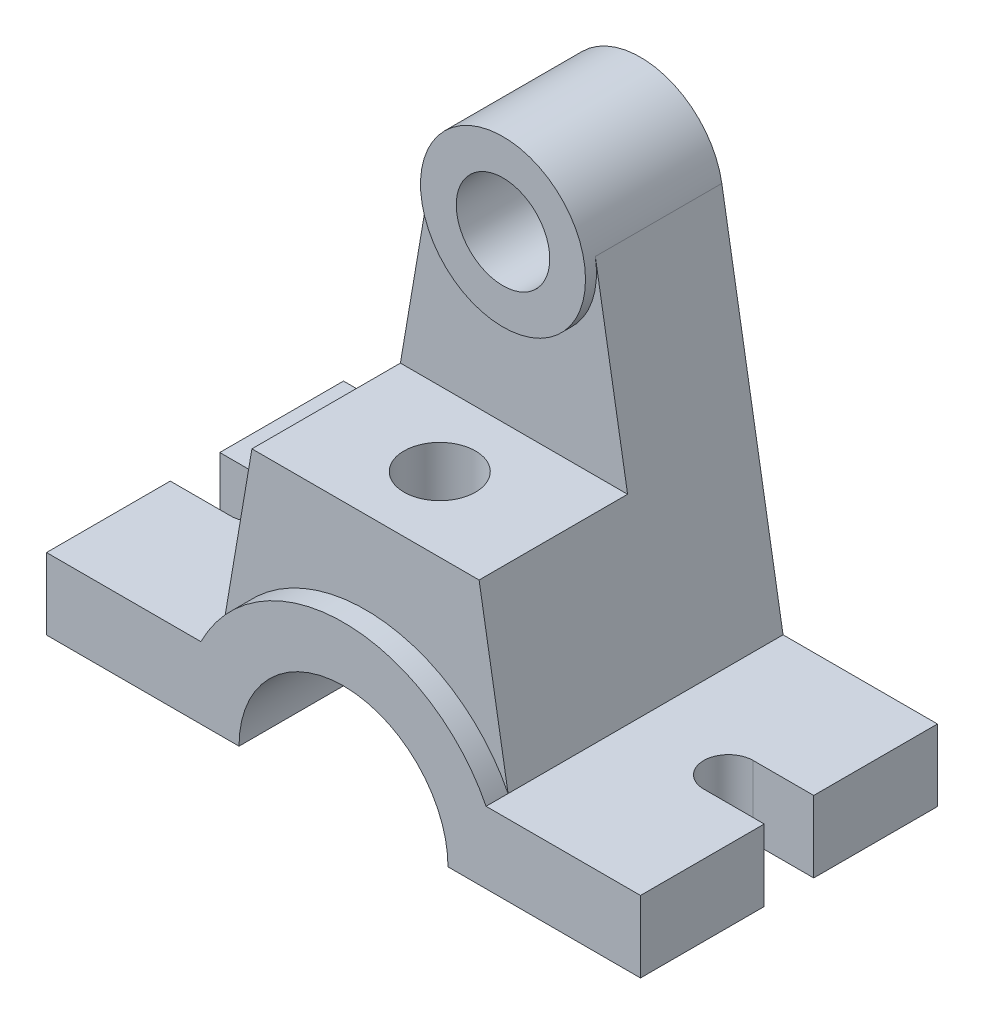
ISO-10303-21;
HEADER;
FILE_DESCRIPTION(('STEP AP214'),'2;1');
FILE_NAME('part.step','',(''),(''),'','','');
FILE_SCHEMA(('AUTOMOTIVE_DESIGN { 1 0 10303 214 1 1 1 1 }'));
ENDSEC;
DATA;
#1=APPLICATION_CONTEXT('core data for automotive mechanical design processes');
#2=APPLICATION_PROTOCOL_DEFINITION('international standard','automotive_design',2000,#1);
#3=PRODUCT_CONTEXT('',#1,'mechanical');
#4=PRODUCT('Part','Part','',(#3));
#5=PRODUCT_RELATED_PRODUCT_CATEGORY('part','',(#4));
#6=PRODUCT_DEFINITION_FORMATION('','',#4);
#7=PRODUCT_DEFINITION_CONTEXT('part definition',#1,'design');
#8=PRODUCT_DEFINITION('design','',#6,#7);
#9=PRODUCT_DEFINITION_SHAPE('','',#8);
#10=(LENGTH_UNIT() NAMED_UNIT(*) SI_UNIT(.MILLI.,.METRE.));
#11=(NAMED_UNIT(*) PLANE_ANGLE_UNIT() SI_UNIT($,.RADIAN.));
#12=(NAMED_UNIT(*) SI_UNIT($,.STERADIAN.) SOLID_ANGLE_UNIT());
#13=UNCERTAINTY_MEASURE_WITH_UNIT(LENGTH_MEASURE(1.E-05),#10,'distance_accuracy_value','');
#14=(GEOMETRIC_REPRESENTATION_CONTEXT(3) GLOBAL_UNCERTAINTY_ASSIGNED_CONTEXT((#13)) GLOBAL_UNIT_ASSIGNED_CONTEXT((#10,
#11,#12)) REPRESENTATION_CONTEXT('',''));
#15=CARTESIAN_POINT('',(0.,0.,0.));
#16=DIRECTION('',(0.,0.,1.));
#17=DIRECTION('',(1.,0.,0.));
#18=AXIS2_PLACEMENT_3D('',#15,#16,#17);
#19=CARTESIAN_POINT('',(-54.,0.,54.));
#20=DIRECTION('',(-1.,0.,0.));
#21=DIRECTION('',(0.,0.,1.));
#22=AXIS2_PLACEMENT_3D('',#19,#20,#21);
#23=PLANE('',#22);
#24=DIRECTION('',(0.,1.,0.));
#25=VECTOR('',#24,1.);
#26=CARTESIAN_POINT('',(-54.,-0.000999999999999265,31.5));
#27=LINE('',#26,#25);
#28=CARTESIAN_POINT('',(-54.,0.,31.5));
#29=VERTEX_POINT('',#28);
#30=CARTESIAN_POINT('',(-54.,13.,31.5));
#31=VERTEX_POINT('',#30);
#32=EDGE_CURVE('E216',#29,#31,#27,.T.);
#33=ORIENTED_EDGE('',*,*,#32,.F.);
#34=DIRECTION('',(0.,0.,-1.));
#35=VECTOR('',#34,1.);
#36=CARTESIAN_POINT('',(-54.,0.,54.));
#37=LINE('',#36,#35);
#38=CARTESIAN_POINT('',(-54.,0.,54.));
#39=VERTEX_POINT('',#38);
#40=EDGE_CURVE('E307',#39,#29,#37,.T.);
#41=ORIENTED_EDGE('',*,*,#40,.F.);
#42=DIRECTION('',(0.,1.,0.));
#43=VECTOR('',#42,1.);
#44=CARTESIAN_POINT('',(-54.,0.,54.));
#45=LINE('',#44,#43);
#46=CARTESIAN_POINT('',(-54.,13.,54.));
#47=VERTEX_POINT('',#46);
#48=EDGE_CURVE('E356',#39,#47,#45,.T.);
#49=ORIENTED_EDGE('',*,*,#48,.T.);
#50=DIRECTION('',(0.,0.,-1.));
#51=VECTOR('',#50,1.);
#52=CARTESIAN_POINT('',(-54.,13.,54.));
#53=LINE('',#52,#51);
#54=EDGE_CURVE('E47',#47,#31,#53,.T.);
#55=ORIENTED_EDGE('',*,*,#54,.T.);
#56=EDGE_LOOP('',(#33,#41,#49,#55));
#57=FACE_BOUND('',#56,.T.);
#58=ADVANCED_FACE('F39',(#57),#23,.T.);
#59=CARTESIAN_POINT('',(54.,0.,54.));
#60=DIRECTION('',(-1.,0.,0.));
#61=DIRECTION('',(0.,0.,1.));
#62=AXIS2_PLACEMENT_3D('',#59,#60,#61);
#63=PLANE('',#62);
#64=DIRECTION('',(0.,0.,-1.));
#65=VECTOR('',#64,1.);
#66=CARTESIAN_POINT('',(54.,13.,54.));
#67=LINE('',#66,#65);
#68=CARTESIAN_POINT('',(54.,13.,22.5));
#69=VERTEX_POINT('',#68);
#70=CARTESIAN_POINT('',(54.,13.,0.));
#71=VERTEX_POINT('',#70);
#72=EDGE_CURVE('E322',#69,#71,#67,.T.);
#73=ORIENTED_EDGE('',*,*,#72,.F.);
#74=DIRECTION('',(0.,1.,0.));
#75=VECTOR('',#74,1.);
#76=CARTESIAN_POINT('',(54.,-0.0010000000000062,22.5));
#77=LINE('',#76,#75);
#78=CARTESIAN_POINT('',(54.,0.,22.5));
#79=VERTEX_POINT('',#78);
#80=EDGE_CURVE('E232',#79,#69,#77,.T.);
#81=ORIENTED_EDGE('',*,*,#80,.F.);
#82=DIRECTION('',(0.,0.,-1.));
#83=VECTOR('',#82,1.);
#84=CARTESIAN_POINT('',(54.,0.,54.));
#85=LINE('',#84,#83);
#86=CARTESIAN_POINT('',(54.,0.,0.));
#87=VERTEX_POINT('',#86);
#88=EDGE_CURVE('E318',#79,#87,#85,.T.);
#89=ORIENTED_EDGE('',*,*,#88,.T.);
#90=DIRECTION('',(0.,1.,0.));
#91=VECTOR('',#90,1.);
#92=CARTESIAN_POINT('',(54.,0.,0.));
#93=LINE('',#92,#91);
#94=EDGE_CURVE('E330',#87,#71,#93,.T.);
#95=ORIENTED_EDGE('',*,*,#94,.T.);
#96=EDGE_LOOP('',(#73,#81,#89,#95));
#97=FACE_BOUND('',#96,.T.);
#98=ADVANCED_FACE('F277',(#97),#63,.F.);
#99=CARTESIAN_POINT('',(0.,0.,54.));
#100=DIRECTION('',(0.,0.,-1.));
#101=DIRECTION('',(-1.,0.,0.));
#102=AXIS2_PLACEMENT_3D('',#99,#100,#101);
#103=CYLINDRICAL_SURFACE('',#102,29.);
#104=DIRECTION('',(0.,0.,-1.));
#105=VECTOR('',#104,1.);
#106=CARTESIAN_POINT('',(25.9229627936314,13.,54.));
#107=LINE('',#106,#105);
#108=CARTESIAN_POINT('',(25.9229627936314,13.,54.));
#109=VERTEX_POINT('',#108);
#110=CARTESIAN_POINT('',(25.9229627936314,13.,50.));
#111=VERTEX_POINT('',#110);
#112=EDGE_CURVE('E323',#109,#111,#107,.T.);
#113=ORIENTED_EDGE('',*,*,#112,.T.);
#114=CARTESIAN_POINT('',(0.,0.,50.));
#115=DIRECTION('',(0.,0.,1.));
#116=DIRECTION('',(1.,0.,0.));
#117=AXIS2_PLACEMENT_3D('',#114,#115,#116);
#118=CIRCLE('',#117,29.);
#119=CARTESIAN_POINT('',(-25.9229627936314,13.,50.));
#120=VERTEX_POINT('',#119);
#121=EDGE_CURVE('E373',#111,#120,#118,.T.);
#122=ORIENTED_EDGE('',*,*,#121,.T.);
#123=DIRECTION('',(0.,0.,-1.));
#124=VECTOR('',#123,1.);
#125=CARTESIAN_POINT('',(-25.9229627936314,13.,54.));
#126=LINE('',#125,#124);
#127=CARTESIAN_POINT('',(-25.9229627936314,13.,54.));
#128=VERTEX_POINT('',#127);
#129=EDGE_CURVE('E12',#128,#120,#126,.T.);
#130=ORIENTED_EDGE('',*,*,#129,.F.);
#131=CARTESIAN_POINT('',(0.,0.,54.));
#132=DIRECTION('',(0.,0.,1.));
#133=DIRECTION('',(1.,0.,0.));
#134=AXIS2_PLACEMENT_3D('',#131,#132,#133);
#135=CIRCLE('',#134,29.);
#136=EDGE_CURVE('E329',#109,#128,#135,.T.);
#137=ORIENTED_EDGE('',*,*,#136,.F.);
#138=EDGE_LOOP('',(#113,#122,#130,#137));
#139=FACE_BOUND('',#138,.T.);
#140=ADVANCED_FACE('F41',(#139),#103,.T.);
#141=CARTESIAN_POINT('',(0.,13.,54.));
#142=DIRECTION('',(0.,1.,0.));
#143=DIRECTION('',(-1.,0.,0.));
#144=AXIS2_PLACEMENT_3D('',#141,#142,#143);
#145=PLANE('',#144);
#146=DIRECTION('',(1.,0.,0.));
#147=VECTOR('',#146,1.);
#148=CARTESIAN_POINT('',(-43.,13.,31.5));
#149=LINE('',#148,#147);
#150=CARTESIAN_POINT('',(-43.,13.,31.5));
#151=VERTEX_POINT('',#150);
#152=EDGE_CURVE('E191',#31,#151,#149,.T.);
#153=ORIENTED_EDGE('',*,*,#152,.F.);
#154=ORIENTED_EDGE('',*,*,#54,.F.);
#155=DIRECTION('',(1.,0.,0.));
#156=VECTOR('',#155,1.);
#157=CARTESIAN_POINT('',(0.,13.,54.));
#158=LINE('',#157,#156);
#159=EDGE_CURVE('E359',#47,#128,#158,.T.);
#160=ORIENTED_EDGE('',*,*,#159,.T.);
#161=ORIENTED_EDGE('',*,*,#129,.T.);
#162=DIRECTION('',(0.,0.,-1.));
#163=VECTOR('',#162,1.);
#164=CARTESIAN_POINT('',(-25.9229627936314,13.,114.406953242156));
#165=LINE('',#164,#163);
#166=CARTESIAN_POINT('',(-25.9229627936314,13.,0.));
#167=VERTEX_POINT('',#166);
#168=EDGE_CURVE('E371',#120,#167,#165,.T.);
#169=ORIENTED_EDGE('',*,*,#168,.T.);
#170=DIRECTION('',(1.,0.,0.));
#171=VECTOR('',#170,1.);
#172=CARTESIAN_POINT('',(0.,13.,0.));
#173=LINE('',#172,#171);
#174=CARTESIAN_POINT('',(-54.,13.,0.));
#175=VERTEX_POINT('',#174);
#176=EDGE_CURVE('E305',#175,#167,#173,.T.);
#177=ORIENTED_EDGE('',*,*,#176,.F.);
#178=CARTESIAN_POINT('',(-54.,13.,22.5));
#179=VERTEX_POINT('',#178);
#180=EDGE_CURVE('E300',#179,#175,#53,.T.);
#181=ORIENTED_EDGE('',*,*,#180,.F.);
#182=DIRECTION('',(-1.,0.,0.));
#183=VECTOR('',#182,1.);
#184=CARTESIAN_POINT('',(-43.,13.,22.5));
#185=LINE('',#184,#183);
#186=CARTESIAN_POINT('',(-43.,13.,22.5));
#187=VERTEX_POINT('',#186);
#188=EDGE_CURVE('E211',#187,#179,#185,.T.);
#189=ORIENTED_EDGE('',*,*,#188,.F.);
#190=CARTESIAN_POINT('',(-43.,13.,27.));
#191=DIRECTION('',(0.,1.,0.));
#192=DIRECTION('',(-1.,0.,0.));
#193=AXIS2_PLACEMENT_3D('',#190,#191,#192);
#194=CIRCLE('',#193,4.5);
#195=EDGE_CURVE('E189',#151,#187,#194,.T.);
#196=ORIENTED_EDGE('',*,*,#195,.F.);
#197=EDGE_LOOP('',(#153,#154,#160,#161,#169,#177,#181,#189,#196));
#198=FACE_BOUND('',#197,.T.);
#199=ADVANCED_FACE('F290',(#198),#145,.T.);
#200=DIRECTION('',(0.,1.,0.));
#201=VECTOR('',#200,1.);
#202=CARTESIAN_POINT('',(-54.,-0.000999999999999265,22.5));
#203=LINE('',#202,#201);
#204=CARTESIAN_POINT('',(-54.,0.,22.5));
#205=VERTEX_POINT('',#204);
#206=EDGE_CURVE('E54',#205,#179,#203,.T.);
#207=ORIENTED_EDGE('',*,*,#206,.T.);
#208=ORIENTED_EDGE('',*,*,#180,.T.);
#209=DIRECTION('',(0.,1.,0.));
#210=VECTOR('',#209,1.);
#211=CARTESIAN_POINT('',(-54.,0.,0.));
#212=LINE('',#211,#210);
#213=CARTESIAN_POINT('',(-54.,0.,0.));
#214=VERTEX_POINT('',#213);
#215=EDGE_CURVE('E342',#214,#175,#212,.T.);
#216=ORIENTED_EDGE('',*,*,#215,.F.);
#217=EDGE_CURVE('E302',#205,#214,#37,.T.);
#218=ORIENTED_EDGE('',*,*,#217,.F.);
#219=EDGE_LOOP('',(#207,#208,#216,#218));
#220=FACE_BOUND('',#219,.T.);
#221=ADVANCED_FACE('F280',(#220),#23,.T.);
#222=CARTESIAN_POINT('',(0.,0.,54.));
#223=DIRECTION('',(0.,1.,0.));
#224=DIRECTION('',(0.,0.,1.));
#225=AXIS2_PLACEMENT_3D('',#222,#223,#224);
#226=PLANE('',#225);
#227=ORIENTED_EDGE('',*,*,#40,.T.);
#228=DIRECTION('',(-1.,0.,0.));
#229=VECTOR('',#228,1.);
#230=CARTESIAN_POINT('',(-43.,0.,31.5));
#231=LINE('',#230,#229);
#232=CARTESIAN_POINT('',(-43.,0.,31.5));
#233=VERTEX_POINT('',#232);
#234=EDGE_CURVE('E202',#233,#29,#231,.T.);
#235=ORIENTED_EDGE('',*,*,#234,.F.);
#236=CARTESIAN_POINT('',(-43.,0.,27.));
#237=DIRECTION('',(0.,1.,0.));
#238=DIRECTION('',(0.,0.,1.));
#239=AXIS2_PLACEMENT_3D('',#236,#237,#238);
#240=CIRCLE('',#239,4.5);
#241=CARTESIAN_POINT('',(-43.,0.,22.5));
#242=VERTEX_POINT('',#241);
#243=EDGE_CURVE('E186',#242,#233,#240,.F.);
#244=ORIENTED_EDGE('',*,*,#243,.F.);
#245=DIRECTION('',(1.,0.,0.));
#246=VECTOR('',#245,1.);
#247=CARTESIAN_POINT('',(-43.,0.,22.5));
#248=LINE('',#247,#246);
#249=EDGE_CURVE('E193',#205,#242,#248,.T.);
#250=ORIENTED_EDGE('',*,*,#249,.F.);
#251=ORIENTED_EDGE('',*,*,#217,.T.);
#252=DIRECTION('',(1.,0.,0.));
#253=VECTOR('',#252,1.);
#254=CARTESIAN_POINT('',(0.,0.,0.));
#255=LINE('',#254,#253);
#256=CARTESIAN_POINT('',(-19.,0.,0.));
#257=VERTEX_POINT('',#256);
#258=EDGE_CURVE('E339',#214,#257,#255,.T.);
#259=ORIENTED_EDGE('',*,*,#258,.T.);
#260=DIRECTION('',(0.,0.,-1.));
#261=VECTOR('',#260,1.);
#262=CARTESIAN_POINT('',(-19.,0.,54.));
#263=LINE('',#262,#261);
#264=CARTESIAN_POINT('',(-19.,0.,54.));
#265=VERTEX_POINT('',#264);
#266=EDGE_CURVE('E311',#265,#257,#263,.T.);
#267=ORIENTED_EDGE('',*,*,#266,.F.);
#268=DIRECTION('',(1.,0.,0.));
#269=VECTOR('',#268,1.);
#270=CARTESIAN_POINT('',(0.,0.,54.));
#271=LINE('',#270,#269);
#272=EDGE_CURVE('E354',#39,#265,#271,.T.);
#273=ORIENTED_EDGE('',*,*,#272,.F.);
#274=EDGE_LOOP('',(#227,#235,#244,#250,#251,#259,#267,#273));
#275=FACE_BOUND('',#274,.T.);
#276=ADVANCED_FACE('F201',(#275),#226,.F.);
#277=CARTESIAN_POINT('',(0.,0.,54.));
#278=DIRECTION('',(0.,0.,-1.));
#279=DIRECTION('',(-1.,0.,0.));
#280=AXIS2_PLACEMENT_3D('',#277,#278,#279);
#281=CYLINDRICAL_SURFACE('',#280,19.);
#282=CARTESIAN_POINT('',(-6.5,17.8535710713571,36.5));
#283=CARTESIAN_POINT('',(-6.5000002148291,17.853570895077,36.6766860603921));
#284=CARTESIAN_POINT('',(-6.49278991458106,17.8562009887203,36.8533689552782));
#285=CARTESIAN_POINT('',(-6.46401745754939,17.8666368426975,37.205471318334));
#286=CARTESIAN_POINT('',(-6.44245017864706,17.8744444502017,37.3808903129981));
#287=CARTESIAN_POINT('',(-6.38518112420357,17.8949820920279,37.7290564066361));
#288=CARTESIAN_POINT('',(-6.34948341911754,17.9077107087639,37.9018042601902));
#289=CARTESIAN_POINT('',(-6.26427517948574,17.9376947711692,38.2435246609188));
#290=CARTESIAN_POINT('',(-6.21475923356849,17.9549519901296,38.4124957009961));
#291=CARTESIAN_POINT('',(-6.10249953588161,17.993415656379,38.7450440265586));
#292=CARTESIAN_POINT('',(-6.03978881954658,18.0146122256233,38.9086336242665));
#293=CARTESIAN_POINT('',(-5.90155243625608,18.060370366392,39.2298845490874));
#294=CARTESIAN_POINT('',(-5.82602201096172,18.0849331867261,39.3875436483141));
#295=CARTESIAN_POINT('',(-5.66274092715389,18.1367222997667,39.6959032490217));
#296=CARTESIAN_POINT('',(-5.57499237040163,18.1639481341429,39.8466049413905));
#297=CARTESIAN_POINT('',(-5.38783299904144,18.2203405069722,40.1402727535736));
#298=CARTESIAN_POINT('',(-5.28841798788063,18.2495077421256,40.283236062618));
#299=CARTESIAN_POINT('',(-5.07466086432228,18.3101231773006,40.5657535971284));
#300=CARTESIAN_POINT('',(-4.95990033731122,18.3416158765121,40.7049818561912));
#301=CARTESIAN_POINT('',(-4.71925904371116,18.4050012967611,40.9733747668587));
#302=CARTESIAN_POINT('',(-4.593378048459,18.4368940260127,41.1025392114246));
#303=CARTESIAN_POINT('',(-4.33121477324462,18.5002369260012,41.3500605880986));
#304=CARTESIAN_POINT('',(-4.19492894024465,18.5316869411791,41.4684137978152));
#305=CARTESIAN_POINT('',(-3.91285672226075,18.593288636673,41.6934665230051));
#306=CARTESIAN_POINT('',(-3.76707366303204,18.6234407654077,41.8001700833191));
#307=CARTESIAN_POINT('',(-3.46261136089441,18.6824793088382,42.0040735324503));
#308=CARTESIAN_POINT('',(-3.30368474424494,18.7113062838221,42.1009217750141));
#309=CARTESIAN_POINT('',(-2.97777132561859,18.7659309362686,42.2807876593676));
#310=CARTESIAN_POINT('',(-2.8107877485438,18.7917298118043,42.3638107765749));
#311=CARTESIAN_POINT('',(-2.46981246984958,18.839577119678,42.5153836968466));
#312=CARTESIAN_POINT('',(-2.29581941042649,18.8616248210152,42.5839306795369));
#313=CARTESIAN_POINT('',(-1.9421946274131,18.901309877292,42.7058714761285));
#314=CARTESIAN_POINT('',(-1.76256550389699,18.9189492332092,42.7592721665245));
#315=CARTESIAN_POINT('',(-1.40554058787486,18.9487566255892,42.8487867432672));
#316=CARTESIAN_POINT('',(-1.22829832356807,18.9610992111755,42.8854551622025));
#317=CARTESIAN_POINT('',(-0.8711738974665,18.9808593097372,42.9438946420888));
#318=CARTESIAN_POINT('',(-0.691292859926852,18.9882788612685,42.9656718693772));
#319=CARTESIAN_POINT('',(-0.33020898898974,18.9979888413776,42.9941326805786));
#320=CARTESIAN_POINT('',(-0.149006204565978,19.0002794590352,43.0008168209031));
#321=CARTESIAN_POINT('',(0.213313315196808,18.999666127711,42.9990241241095));
#322=CARTESIAN_POINT('',(0.39443005253819,18.9967623061915,42.9905476590056));
#323=CARTESIAN_POINT('',(0.747670706946147,18.9860714653988,42.9591883251865));
#324=CARTESIAN_POINT('',(0.919855748453254,18.9784922265128,42.936918294046));
#325=CARTESIAN_POINT('',(1.26170205476153,18.9588351115384,42.8787286094169));
#326=CARTESIAN_POINT('',(1.43136244801132,18.9467557177445,42.8428043508717));
#327=CARTESIAN_POINT('',(1.76688667474987,18.918415648069,42.757640187005));
#328=CARTESIAN_POINT('',(1.93275172616272,18.9021563346102,42.7084046201651));
#329=CARTESIAN_POINT('',(2.25972276691623,18.8658613209617,42.5970071011161));
#330=CARTESIAN_POINT('',(2.42082693264722,18.845824194862,42.5348402671699));
#331=CARTESIAN_POINT('',(2.73928547509094,18.8021936064984,42.3971857575688));
#332=CARTESIAN_POINT('',(2.89656306703924,18.7785569889293,42.3215342246869));
#333=CARTESIAN_POINT('',(3.20424085494854,18.7285115650352,42.1580211460703));
#334=CARTESIAN_POINT('',(3.35463867584177,18.7021018115704,42.0701554253485));
#335=CARTESIAN_POINT('',(3.64764096934546,18.6471696643123,41.8828386754255));
#336=CARTESIAN_POINT('',(3.79024494593414,18.6186471363277,41.7833869101148));
#337=CARTESIAN_POINT('',(4.06685586879446,18.5601904838667,41.5735415335601));
#338=CARTESIAN_POINT('',(4.20086248460923,18.5302563052073,41.4631475021424));
#339=CARTESIAN_POINT('',(4.46596173292866,18.4682058458828,41.2263432953263));
#340=CARTESIAN_POINT('',(4.59657953214494,18.436055006079,41.0994101120068));
#341=CARTESIAN_POINT('',(4.84668315560393,18.3718896500712,40.8350618820427));
#342=CARTESIAN_POINT('',(4.9661724277864,18.3398750945958,40.6976501061288));
#343=CARTESIAN_POINT('',(5.19336914099636,18.276838508895,40.4130659609434));
#344=CARTESIAN_POINT('',(5.30107014904269,18.2458170270689,40.2658883320114));
#345=CARTESIAN_POINT('',(5.50384478423424,18.1856777718684,39.9627915813628));
#346=CARTESIAN_POINT('',(5.5989233383522,18.1565592579677,39.8068759044005));
#347=CARTESIAN_POINT('',(5.77723848946361,18.1006185760148,39.4846223860579));
#348=CARTESIAN_POINT('',(5.86025830124941,18.0738412491271,39.3181566266125));
#349=CARTESIAN_POINT('',(6.01186650239368,18.0239793588866,38.9783188669158));
#350=CARTESIAN_POINT('',(6.08046054995929,18.0008933485461,38.8049496062733));
#351=CARTESIAN_POINT('',(6.2026219586455,17.9591662187754,38.4525008148424));
#352=CARTESIAN_POINT('',(6.2561917483925,17.940524381031,38.2734222121702));
#353=CARTESIAN_POINT('',(6.3477831319202,17.9083224235605,37.9108857529974));
#354=CARTESIAN_POINT('',(6.38580557940465,17.8947620248164,37.7274281375337));
#355=CARTESIAN_POINT('',(6.44447993225556,17.8737125880975,37.3663368265086));
#356=CARTESIAN_POINT('',(6.46586751584687,17.8659670196545,37.1888373705914));
#357=CARTESIAN_POINT('',(6.49394759160291,17.8557797517071,36.8325305263839));
#358=CARTESIAN_POINT('',(6.50064064006667,17.853337851419,36.653723187864));
#359=CARTESIAN_POINT('',(6.49926292789702,17.8538393994344,36.296204622774));
#360=CARTESIAN_POINT('',(6.4911946754973,17.8567819328175,36.1174933850358));
#361=CARTESIAN_POINT('',(6.46038308036267,17.8679522668607,35.7615099004538));
#362=CARTESIAN_POINT('',(6.43763993677124,17.8761799957989,35.5842376341157));
#363=CARTESIAN_POINT('',(6.37882360722109,17.8972495864418,35.2389973924295));
#364=CARTESIAN_POINT('',(6.34327634381487,17.9099089133165,35.0709282462008));
#365=CARTESIAN_POINT('',(6.25909609973112,17.939501246374,34.7384278066503));
#366=CARTESIAN_POINT('',(6.21045879662253,17.9564356641097,34.5739977344232));
#367=CARTESIAN_POINT('',(6.10052464596032,17.9940815341905,34.249917175638));
#368=CARTESIAN_POINT('',(6.03923058652121,18.0147921545711,34.0902656452842));
#369=CARTESIAN_POINT('',(5.90442776490078,18.0594233626844,33.7766041995111));
#370=CARTESIAN_POINT('',(5.83091435627086,18.0833451708137,33.6225964574538));
#371=CARTESIAN_POINT('',(5.66962281488838,18.134573763878,33.316242299734));
#372=CARTESIAN_POINT('',(5.58145767731501,18.1619654955567,33.1641138425405));
#373=CARTESIAN_POINT('',(5.39326121023584,18.2187374297615,32.8677052367052));
#374=CARTESIAN_POINT('',(5.29322578968922,18.2481183163342,32.7234278190235));
#375=CARTESIAN_POINT('',(5.08194357071369,18.3080830829531,32.4435739846757));
#376=CARTESIAN_POINT('',(4.97069561995214,18.3386670864487,32.3079984646682));
#377=CARTESIAN_POINT('',(4.73766488524147,18.4002460208145,32.0463242165038));
#378=CARTESIAN_POINT('',(4.61588183778346,18.4312409619469,31.9202257255384));
#379=CARTESIAN_POINT('',(4.35596592199526,18.4944410503394,31.6720100080665));
#380=CARTESIAN_POINT('',(4.21731454396463,18.5266265792629,31.5504300128235));
#381=CARTESIAN_POINT('',(3.93005120130701,18.5896829277256,31.3193956838302));
#382=CARTESIAN_POINT('',(3.78144256582146,18.6205541810941,31.2099373294413));
#383=CARTESIAN_POINT('',(3.47509192920744,18.6801523421,31.0038350108496));
#384=CARTESIAN_POINT('',(3.3173464197743,18.7088784162259,30.9071960164155));
#385=CARTESIAN_POINT('',(2.9938610742654,18.7633601074712,30.7275648759048));
#386=CARTESIAN_POINT('',(2.82812464214939,18.7891169738277,30.6445669842928));
#387=CARTESIAN_POINT('',(2.49068505305386,18.8368084556662,30.4932972650427));
#388=CARTESIAN_POINT('',(2.31902143356697,18.8587640850576,30.4249439458177));
#389=CARTESIAN_POINT('',(1.97012086377875,18.8983975980319,30.3030041328156));
#390=CARTESIAN_POINT('',(1.79288622275915,18.9160772283404,30.2494116080776));
#391=CARTESIAN_POINT('',(1.4341176525777,18.9466543956041,30.1574773389591));
#392=CARTESIAN_POINT('',(1.25258420341963,18.9595524638136,30.1191339002981));
#393=CARTESIAN_POINT('',(0.886619437101909,18.9801866995635,30.0580813871378));
#394=CARTESIAN_POINT('',(0.7021882532375,18.9879231038319,30.0353715956348));
#395=CARTESIAN_POINT('',(0.341093096579473,18.9977537685051,30.006555696822));
#396=CARTESIAN_POINT('',(0.164496983102196,19.0001085603486,29.9996827587751));
#397=CARTESIAN_POINT('',(-0.188728030227075,18.9998837140953,30.0003398236063));
#398=CARTESIAN_POINT('',(-0.365356920807142,18.9973023977497,30.0078747250682));
#399=CARTESIAN_POINT('',(-0.717193705741854,18.9872745269493,30.0372773736058));
#400=CARTESIAN_POINT('',(-0.892402217078473,18.9798302137517,30.0591385180199));
#401=CARTESIAN_POINT('',(-1.2402720943142,18.9602765373715,30.1169892007255));
#402=CARTESIAN_POINT('',(-1.41293248395023,18.9481654320269,30.1529840153583));
#403=CARTESIAN_POINT('',(-1.75136029532633,18.9198588156358,30.2380009141308));
#404=CARTESIAN_POINT('',(-1.91719577924434,18.9037402970376,30.2867782736673));
#405=CARTESIAN_POINT('',(-2.24414761863645,18.8677201080132,30.3972475005863));
#406=CARTESIAN_POINT('',(-2.4052622729316,18.8478170927093,30.4589439597563));
#407=CARTESIAN_POINT('',(-2.72167610463477,18.8047326600845,30.5947384957133));
#408=CARTESIAN_POINT('',(-2.87697653390207,18.7815519536768,30.668833883879));
#409=CARTESIAN_POINT('',(-3.18093732583099,18.7324678212632,30.8289193932698));
#410=CARTESIAN_POINT('',(-3.32959528034837,18.7065634190472,30.9149137827754));
#411=CARTESIAN_POINT('',(-3.62488123177352,18.651638997383,31.1016760569576));
#412=CARTESIAN_POINT('',(-3.77121791452353,18.6225380323364,31.2028808577256));
#413=CARTESIAN_POINT('',(-4.05491891520694,18.5628298201437,31.4167731787455));
#414=CARTESIAN_POINT('',(-4.19228289845117,18.5322225168847,31.5294611269275));
#415=CARTESIAN_POINT('',(-4.45730329059838,18.4702727876855,31.7656607818792));
#416=CARTESIAN_POINT('',(-4.58495524171088,18.4389300327088,31.8891774036572));
#417=CARTESIAN_POINT('',(-4.82969742609018,18.3763428189875,32.146207984045));
#418=CARTESIAN_POINT('',(-4.94679101720317,18.3450983320636,32.2797187393505));
#419=CARTESIAN_POINT('',(-5.17447691460187,18.2822133305173,32.561850552415));
#420=CARTESIAN_POINT('',(-5.28458470541643,18.2506119689236,32.7108718857484));
#421=CARTESIAN_POINT('',(-5.49180150942026,18.1893317762189,33.0179865151986));
#422=CARTESIAN_POINT('',(-5.58891534540408,18.1596522339341,33.1760764141554));
#423=CARTESIAN_POINT('',(-5.76948403304597,18.103093988818,33.5004147844253));
#424=CARTESIAN_POINT('',(-5.85293523653683,18.0762160347545,33.6666654194476));
#425=CARTESIAN_POINT('',(-6.00542017104138,18.0261302467408,34.0061019934354));
#426=CARTESIAN_POINT('',(-6.07446034499638,18.0029207738028,34.1792847916902));
#427=CARTESIAN_POINT('',(-6.19587417137214,17.9614907155954,34.5266592784415));
#428=CARTESIAN_POINT('',(-6.24864822668308,17.9431521372603,34.7006968856488));
#429=CARTESIAN_POINT('',(-6.33948316951621,17.911261091186,35.0529285271615));
#430=CARTESIAN_POINT('',(-6.37755022573386,17.8977066170114,35.2311207855148));
#431=CARTESIAN_POINT('',(-6.43861432940393,17.8758300559938,35.5903645607804));
#432=CARTESIAN_POINT('',(-6.4616134253497,17.8675072579092,35.7714156856003));
#433=CARTESIAN_POINT('',(-6.49230596099804,17.8563779246427,36.1349790235665));
#434=CARTESIAN_POINT('',(-6.49999977809114,17.8535712534466,36.3174912005753));
#435=CARTESIAN_POINT('',(-6.5,17.8535710713571,36.5));
#436=B_SPLINE_CURVE_WITH_KNOTS('',3,(#282,#283,#284,#285,#286,#287,#288,#289,#290,#291,#292,
#293,#294,#295,#296,#297,#298,#299,#300,#301,#302,#303,#304,#305,#306,#307,#308,#309,#310,#311,
#312,#313,#314,#315,#316,#317,#318,#319,#320,#321,#322,#323,#324,#325,#326,#327,#328,#329,#330,
#331,#332,#333,#334,#335,#336,#337,#338,#339,#340,#341,#342,#343,#344,#345,#346,#347,#348,#349,
#350,#351,#352,#353,#354,#355,#356,#357,#358,#359,#360,#361,#362,#363,#364,#365,#366,#367,#368,
#369,#370,#371,#372,#373,#374,#375,#376,#377,#378,#379,#380,#381,#382,#383,#384,#385,#386,#387,
#388,#389,#390,#391,#392,#393,#394,#395,#396,#397,#398,#399,#400,#401,#402,#403,#404,#405,#406,
#407,#408,#409,#410,#411,#412,#413,#414,#415,#416,#417,#418,#419,#420,#421,#422,#423,#424,#425,
#426,#427,#428,#429,#430,#431,#432,#433,#434,#435),.UNSPECIFIED.,.T.,.F.,(4,2,2,2,2,2,2,2,2,2,2,
2,2,2,2,2,2,2,2,2,2,2,2,2,2,2,2,2,2,2,2,2,2,2,2,2,2,2,2,2,2,2,2,2,2,2,2,2,2,2,2,2,2,2,2,2,2,2,2,
2,2,2,2,2,2,2,2,2,2,2,2,2,2,2,2,2,4),(0.,0.529887046135423,1.05996324070396,1.58988685084397,
2.12001827668118,2.64883789091034,3.17785422004793,3.70677966003935,4.23589594695641,
4.78474466816603,5.33360467763353,5.88265295709159,6.43150999274939,6.99580190898123,
7.55986980406182,8.12404749487742,8.68796863461659,9.23152922857593,9.77486460139933,
10.318179943662,10.8614819541162,11.3822235111525,11.9031408507726,12.4238886149184,
12.944833326703,13.4726034234455,14.0005543653129,14.5285388684029,15.0565436534963,
15.6107577329832,16.1647995256636,16.719142173063,17.2732678014732,17.8363700083403,
18.3992509364046,18.9620408239367,19.5247998045541,20.0609762818872,20.5971324605443,
21.1331975442424,21.6692553535005,22.1854227733725,22.7017608452323,23.2179852958143,
23.7344064934304,24.2676685797688,24.8011149892779,25.3346162780801,25.8681309149327,
26.4290507909938,26.9897840541985,27.5507340693086,28.1114472073962,28.6689541221214,
29.2262329117872,29.7834497665571,30.34064106407,30.8702283727435,31.3999957701184,
31.929519180481,32.4592404592399,32.979479602021,33.4999039662724,34.0202156260099,
34.5407144124807,35.080973152866,35.6212520338581,36.161777423433,36.7021303004019,
37.2653399964163,37.8283400700077,38.3914902303665,38.9543880734357,39.5020555967996,
40.0494931567647,40.5968562769903,41.14420590042),.UNSPECIFIED.);
#437=CARTESIAN_POINT('',(-6.5,17.8535710713571,36.5));
#438=VERTEX_POINT('',#437);
#439=EDGE_CURVE('E197',#438,#438,#436,.T.);
#440=ORIENTED_EDGE('',*,*,#439,.T.);
#441=EDGE_LOOP('',(#440));
#442=FACE_BOUND('',#441,.T.);
#443=CARTESIAN_POINT('',(0.,0.,0.));
#444=DIRECTION('',(0.,0.,1.));
#445=DIRECTION('',(1.,0.,0.));
#446=AXIS2_PLACEMENT_3D('',#443,#444,#445);
#447=CIRCLE('',#446,19.);
#448=CARTESIAN_POINT('',(19.,0.,0.));
#449=VERTEX_POINT('',#448);
#450=EDGE_CURVE('E336',#449,#257,#447,.T.);
#451=ORIENTED_EDGE('',*,*,#450,.F.);
#452=DIRECTION('',(0.,0.,-1.));
#453=VECTOR('',#452,1.);
#454=CARTESIAN_POINT('',(19.,0.,54.));
#455=LINE('',#454,#453);
#456=CARTESIAN_POINT('',(19.,0.,54.));
#457=VERTEX_POINT('',#456);
#458=EDGE_CURVE('E313',#457,#449,#455,.T.);
#459=ORIENTED_EDGE('',*,*,#458,.F.);
#460=CARTESIAN_POINT('',(0.,0.,54.));
#461=DIRECTION('',(0.,0.,1.));
#462=DIRECTION('',(1.,0.,0.));
#463=AXIS2_PLACEMENT_3D('',#460,#461,#462);
#464=CIRCLE('',#463,19.);
#465=EDGE_CURVE('E351',#457,#265,#464,.T.);
#466=ORIENTED_EDGE('',*,*,#465,.T.);
#467=ORIENTED_EDGE('',*,*,#266,.T.);
#468=EDGE_LOOP('',(#451,#459,#466,#467));
#469=FACE_BOUND('',#468,.T.);
#470=ADVANCED_FACE('F296',(#442,#469),#281,.F.);
#471=CARTESIAN_POINT('',(0.,0.,54.));
#472=DIRECTION('',(0.,1.,0.));
#473=DIRECTION('',(0.,0.,1.));
#474=AXIS2_PLACEMENT_3D('',#471,#472,#473);
#475=PLANE('',#474);
#476=ORIENTED_EDGE('',*,*,#88,.F.);
#477=DIRECTION('',(1.,0.,0.));
#478=VECTOR('',#477,1.);
#479=CARTESIAN_POINT('',(43.,0.,22.5));
#480=LINE('',#479,#478);
#481=CARTESIAN_POINT('',(43.,0.,22.5));
#482=VERTEX_POINT('',#481);
#483=EDGE_CURVE('E222',#482,#79,#480,.T.);
#484=ORIENTED_EDGE('',*,*,#483,.F.);
#485=CARTESIAN_POINT('',(43.,0.,27.));
#486=DIRECTION('',(0.,1.,0.));
#487=DIRECTION('',(0.,0.,1.));
#488=AXIS2_PLACEMENT_3D('',#485,#486,#487);
#489=CIRCLE('',#488,4.5);
#490=CARTESIAN_POINT('',(43.,0.,31.5));
#491=VERTEX_POINT('',#490);
#492=EDGE_CURVE('E219',#491,#482,#489,.F.);
#493=ORIENTED_EDGE('',*,*,#492,.F.);
#494=DIRECTION('',(-1.,0.,0.));
#495=VECTOR('',#494,1.);
#496=CARTESIAN_POINT('',(43.,0.,31.5));
#497=LINE('',#496,#495);
#498=CARTESIAN_POINT('',(54.,0.,31.5));
#499=VERTEX_POINT('',#498);
#500=EDGE_CURVE('E203',#499,#491,#497,.T.);
#501=ORIENTED_EDGE('',*,*,#500,.F.);
#502=CARTESIAN_POINT('',(54.,0.,54.));
#503=VERTEX_POINT('',#502);
#504=EDGE_CURVE('E315',#503,#499,#85,.T.);
#505=ORIENTED_EDGE('',*,*,#504,.F.);
#506=DIRECTION('',(1.,0.,0.));
#507=VECTOR('',#506,1.);
#508=CARTESIAN_POINT('',(0.,0.,54.));
#509=LINE('',#508,#507);
#510=EDGE_CURVE('E349',#457,#503,#509,.T.);
#511=ORIENTED_EDGE('',*,*,#510,.F.);
#512=ORIENTED_EDGE('',*,*,#458,.T.);
#513=DIRECTION('',(1.,0.,0.));
#514=VECTOR('',#513,1.);
#515=CARTESIAN_POINT('',(0.,0.,0.));
#516=LINE('',#515,#514);
#517=EDGE_CURVE('E333',#449,#87,#516,.T.);
#518=ORIENTED_EDGE('',*,*,#517,.T.);
#519=EDGE_LOOP('',(#476,#484,#493,#501,#505,#511,#512,#518));
#520=FACE_BOUND('',#519,.T.);
#521=ADVANCED_FACE('F464',(#520),#475,.F.);
#522=ORIENTED_EDGE('',*,*,#504,.T.);
#523=DIRECTION('',(0.,1.,0.));
#524=VECTOR('',#523,1.);
#525=CARTESIAN_POINT('',(54.,-0.0010000000000062,31.5));
#526=LINE('',#525,#524);
#527=CARTESIAN_POINT('',(54.,13.,31.5));
#528=VERTEX_POINT('',#527);
#529=EDGE_CURVE('E234',#499,#528,#526,.T.);
#530=ORIENTED_EDGE('',*,*,#529,.T.);
#531=CARTESIAN_POINT('',(54.,13.,54.));
#532=VERTEX_POINT('',#531);
#533=EDGE_CURVE('E319',#532,#528,#67,.T.);
#534=ORIENTED_EDGE('',*,*,#533,.F.);
#535=DIRECTION('',(0.,1.,0.));
#536=VECTOR('',#535,1.);
#537=CARTESIAN_POINT('',(54.,0.,54.));
#538=LINE('',#537,#536);
#539=EDGE_CURVE('E347',#503,#532,#538,.T.);
#540=ORIENTED_EDGE('',*,*,#539,.F.);
#541=EDGE_LOOP('',(#522,#530,#534,#540));
#542=FACE_BOUND('',#541,.T.);
#543=ADVANCED_FACE('F286',(#542),#63,.F.);
#544=CARTESIAN_POINT('',(0.,13.,54.));
#545=DIRECTION('',(0.,-1.,0.));
#546=DIRECTION('',(1.,0.,0.));
#547=AXIS2_PLACEMENT_3D('',#544,#545,#546);
#548=PLANE('',#547);
#549=CARTESIAN_POINT('',(43.,13.,27.));
#550=DIRECTION('',(0.,1.,0.));
#551=DIRECTION('',(1.,0.,0.));
#552=AXIS2_PLACEMENT_3D('',#549,#550,#551);
#553=CIRCLE('',#552,4.5);
#554=CARTESIAN_POINT('',(43.,13.,22.5));
#555=VERTEX_POINT('',#554);
#556=CARTESIAN_POINT('',(43.,13.,31.5));
#557=VERTEX_POINT('',#556);
#558=EDGE_CURVE('E62',#555,#557,#553,.T.);
#559=ORIENTED_EDGE('',*,*,#558,.F.);
#560=DIRECTION('',(-1.,0.,0.));
#561=VECTOR('',#560,1.);
#562=CARTESIAN_POINT('',(43.,13.,22.5));
#563=LINE('',#562,#561);
#564=EDGE_CURVE('E227',#69,#555,#563,.T.);
#565=ORIENTED_EDGE('',*,*,#564,.F.);
#566=ORIENTED_EDGE('',*,*,#72,.T.);
#567=DIRECTION('',(-1.,0.,0.));
#568=VECTOR('',#567,1.);
#569=CARTESIAN_POINT('',(0.,13.,0.));
#570=LINE('',#569,#568);
#571=CARTESIAN_POINT('',(25.9229627936314,13.,0.));
#572=VERTEX_POINT('',#571);
#573=EDGE_CURVE('E327',#71,#572,#570,.T.);
#574=ORIENTED_EDGE('',*,*,#573,.T.);
#575=DIRECTION('',(0.,0.,-1.));
#576=VECTOR('',#575,1.);
#577=CARTESIAN_POINT('',(25.9229627936314,13.,114.406953242156));
#578=LINE('',#577,#576);
#579=EDGE_CURVE('E367',#111,#572,#578,.T.);
#580=ORIENTED_EDGE('',*,*,#579,.F.);
#581=ORIENTED_EDGE('',*,*,#112,.F.);
#582=DIRECTION('',(-1.,0.,0.));
#583=VECTOR('',#582,1.);
#584=CARTESIAN_POINT('',(0.,13.,54.));
#585=LINE('',#584,#583);
#586=EDGE_CURVE('E326',#532,#109,#585,.T.);
#587=ORIENTED_EDGE('',*,*,#586,.F.);
#588=ORIENTED_EDGE('',*,*,#533,.T.);
#589=DIRECTION('',(1.,0.,0.));
#590=VECTOR('',#589,1.);
#591=CARTESIAN_POINT('',(43.,13.,31.5));
#592=LINE('',#591,#590);
#593=EDGE_CURVE('E225',#557,#528,#592,.T.);
#594=ORIENTED_EDGE('',*,*,#593,.F.);
#595=EDGE_LOOP('',(#559,#565,#566,#574,#580,#581,#587,#588,#594));
#596=FACE_BOUND('',#595,.T.);
#597=ADVANCED_FACE('F455',(#596),#548,.F.);
#598=CARTESIAN_POINT('',(0.,0.,54.));
#599=DIRECTION('',(0.,0.,1.));
#600=DIRECTION('',(1.,0.,0.));
#601=AXIS2_PLACEMENT_3D('',#598,#599,#600);
#602=PLANE('',#601);
#603=ORIENTED_EDGE('',*,*,#136,.T.);
#604=ORIENTED_EDGE('',*,*,#159,.F.);
#605=ORIENTED_EDGE('',*,*,#48,.F.);
#606=ORIENTED_EDGE('',*,*,#272,.T.);
#607=ORIENTED_EDGE('',*,*,#465,.F.);
#608=ORIENTED_EDGE('',*,*,#510,.T.);
#609=ORIENTED_EDGE('',*,*,#539,.T.);
#610=ORIENTED_EDGE('',*,*,#586,.T.);
#611=EDGE_LOOP('',(#603,#604,#605,#606,#607,#608,#609,#610));
#612=FACE_BOUND('',#611,.T.);
#613=ADVANCED_FACE('F452',(#612),#602,.T.);
#614=CARTESIAN_POINT('',(0.,0.,0.));
#615=DIRECTION('',(0.,0.,1.));
#616=DIRECTION('',(1.,0.,0.));
#617=AXIS2_PLACEMENT_3D('',#614,#615,#616);
#618=PLANE('',#617);
#619=ORIENTED_EDGE('',*,*,#176,.T.);
#620=DIRECTION('',(0.167562682765122,0.985861424006719,0.));
#621=VECTOR('',#620,1.);
#622=CARTESIAN_POINT('',(-27.3426338232327,4.64731144329064,0.));
#623=LINE('',#622,#621);
#624=CARTESIAN_POINT('',(-14.7879213601008,78.5134402414768,0.));
#625=VERTEX_POINT('',#624);
#626=EDGE_CURVE('E379',#167,#625,#623,.T.);
#627=ORIENTED_EDGE('',*,*,#626,.T.);
#628=CARTESIAN_POINT('',(0.,76.,0.));
#629=DIRECTION('',(0.,0.,1.));
#630=DIRECTION('',(1.,0.,0.));
#631=AXIS2_PLACEMENT_3D('',#628,#629,#630);
#632=CIRCLE('',#631,15.);
#633=CARTESIAN_POINT('',(14.7879213601008,78.5134402414768,0.));
#634=VERTEX_POINT('',#633);
#635=EDGE_CURVE('E405',#634,#625,#632,.T.);
#636=ORIENTED_EDGE('',*,*,#635,.F.);
#637=DIRECTION('',(-0.167562682765122,0.985861424006719,0.));
#638=VECTOR('',#637,1.);
#639=CARTESIAN_POINT('',(27.3426338232327,4.64731144329064,0.));
#640=LINE('',#639,#638);
#641=EDGE_CURVE('E370',#572,#634,#640,.T.);
#642=ORIENTED_EDGE('',*,*,#641,.F.);
#643=ORIENTED_EDGE('',*,*,#573,.F.);
#644=ORIENTED_EDGE('',*,*,#94,.F.);
#645=ORIENTED_EDGE('',*,*,#517,.F.);
#646=ORIENTED_EDGE('',*,*,#450,.T.);
#647=ORIENTED_EDGE('',*,*,#258,.F.);
#648=ORIENTED_EDGE('',*,*,#215,.T.);
#649=EDGE_LOOP('',(#619,#627,#636,#642,#643,#644,#645,#646,#647,#648));
#650=FACE_BOUND('',#649,.T.);
#651=CARTESIAN_POINT('',(0.,76.,0.));
#652=DIRECTION('',(0.,0.,1.));
#653=DIRECTION('',(1.,0.,0.));
#654=AXIS2_PLACEMENT_3D('',#651,#652,#653);
#655=CIRCLE('',#654,8.5);
#656=CARTESIAN_POINT('',(8.50000000000001,76.,0.));
#657=VERTEX_POINT('',#656);
#658=EDGE_CURVE('E241',#657,#657,#655,.T.);
#659=ORIENTED_EDGE('',*,*,#658,.T.);
#660=EDGE_LOOP('',(#659));
#661=FACE_BOUND('',#660,.T.);
#662=ADVANCED_FACE('F447',(#650,#661),#618,.F.);
#663=CARTESIAN_POINT('',(0.,44.,114.406953242156));
#664=DIRECTION('',(0.,1.,0.));
#665=DIRECTION('',(-1.,0.,0.));
#666=AXIS2_PLACEMENT_3D('',#663,#664,#665);
#667=PLANE('',#666);
#668=CARTESIAN_POINT('',(0.,44.,36.5));
#669=DIRECTION('',(0.,1.,0.));
#670=DIRECTION('',(-1.,0.,0.));
#671=AXIS2_PLACEMENT_3D('',#668,#669,#670);
#672=CIRCLE('',#671,6.5);
#673=CARTESIAN_POINT('',(-6.5,44.,36.5));
#674=VERTEX_POINT('',#673);
#675=EDGE_CURVE('E238',#674,#674,#672,.T.);
#676=ORIENTED_EDGE('',*,*,#675,.F.);
#677=EDGE_LOOP('',(#676));
#678=FACE_BOUND('',#677,.T.);
#679=DIRECTION('',(1.,0.,0.));
#680=VECTOR('',#679,1.);
#681=CARTESIAN_POINT('',(0.,44.,23.));
#682=LINE('',#681,#680);
#683=CARTESIAN_POINT('',(-20.654024341199,44.,23.));
#684=VERTEX_POINT('',#683);
#685=CARTESIAN_POINT('',(20.654024341199,44.,23.));
#686=VERTEX_POINT('',#685);
#687=EDGE_CURVE('E401',#684,#686,#682,.T.);
#688=ORIENTED_EDGE('',*,*,#687,.F.);
#689=DIRECTION('',(0.,0.,-1.));
#690=VECTOR('',#689,1.);
#691=CARTESIAN_POINT('',(-20.654024341199,44.,114.406953242156));
#692=LINE('',#691,#690);
#693=CARTESIAN_POINT('',(-20.654024341199,44.,50.));
#694=VERTEX_POINT('',#693);
#695=EDGE_CURVE('E374',#694,#684,#692,.T.);
#696=ORIENTED_EDGE('',*,*,#695,.F.);
#697=DIRECTION('',(1.,0.,0.));
#698=VECTOR('',#697,1.);
#699=CARTESIAN_POINT('',(0.,44.,50.));
#700=LINE('',#699,#698);
#701=CARTESIAN_POINT('',(20.654024341199,44.,50.));
#702=VERTEX_POINT('',#701);
#703=EDGE_CURVE('E366',#694,#702,#700,.T.);
#704=ORIENTED_EDGE('',*,*,#703,.T.);
#705=DIRECTION('',(0.,0.,-1.));
#706=VECTOR('',#705,1.);
#707=CARTESIAN_POINT('',(20.654024341199,44.,114.406953242156));
#708=LINE('',#707,#706);
#709=EDGE_CURVE('E363',#702,#686,#708,.T.);
#710=ORIENTED_EDGE('',*,*,#709,.T.);
#711=EDGE_LOOP('',(#688,#696,#704,#710));
#712=FACE_BOUND('',#711,.T.);
#713=ADVANCED_FACE('F443',(#678,#712),#667,.T.);
#714=CARTESIAN_POINT('',(-27.3426338232327,4.64731144329064,114.406953242156));
#715=DIRECTION('',(-0.985861424006719,0.167562682765122,0.));
#716=DIRECTION('',(-0.167562682765122,-0.985861424006719,0.));
#717=AXIS2_PLACEMENT_3D('',#714,#715,#716);
#718=PLANE('',#717);
#719=ORIENTED_EDGE('',*,*,#168,.F.);
#720=DIRECTION('',(0.167562682765122,0.985861424006719,0.));
#721=VECTOR('',#720,1.);
#722=CARTESIAN_POINT('',(-27.3426338232327,4.64731144329064,50.));
#723=LINE('',#722,#721);
#724=EDGE_CURVE('E365',#120,#694,#723,.T.);
#725=ORIENTED_EDGE('',*,*,#724,.T.);
#726=ORIENTED_EDGE('',*,*,#695,.T.);
#727=DIRECTION('',(0.167562682765122,0.985861424006719,0.));
#728=VECTOR('',#727,1.);
#729=CARTESIAN_POINT('',(-27.3426338232327,4.64731144329064,23.));
#730=LINE('',#729,#728);
#731=CARTESIAN_POINT('',(-14.7879213601008,78.5134402414768,23.));
#732=VERTEX_POINT('',#731);
#733=EDGE_CURVE('E392',#684,#732,#730,.T.);
#734=ORIENTED_EDGE('',*,*,#733,.T.);
#735=DIRECTION('',(0.,0.,-1.));
#736=VECTOR('',#735,1.);
#737=CARTESIAN_POINT('',(-14.7879213601008,78.5134402414768,23.));
#738=LINE('',#737,#736);
#739=EDGE_CURVE('E389',#732,#625,#738,.T.);
#740=ORIENTED_EDGE('',*,*,#739,.T.);
#741=ORIENTED_EDGE('',*,*,#626,.F.);
#742=EDGE_LOOP('',(#719,#725,#726,#734,#740,#741));
#743=FACE_BOUND('',#742,.T.);
#744=ADVANCED_FACE('F439',(#743),#718,.T.);
#745=CARTESIAN_POINT('',(27.3426338232327,4.64731144329064,114.406953242156));
#746=DIRECTION('',(-0.985861424006719,-0.167562682765122,0.));
#747=DIRECTION('',(0.167562682765122,-0.985861424006719,0.));
#748=AXIS2_PLACEMENT_3D('',#745,#746,#747);
#749=PLANE('',#748);
#750=DIRECTION('',(-0.167562682765122,0.985861424006719,0.));
#751=VECTOR('',#750,1.);
#752=CARTESIAN_POINT('',(27.3426338232327,4.64731144329064,50.));
#753=LINE('',#752,#751);
#754=EDGE_CURVE('E345',#111,#702,#753,.T.);
#755=ORIENTED_EDGE('',*,*,#754,.F.);
#756=ORIENTED_EDGE('',*,*,#579,.T.);
#757=ORIENTED_EDGE('',*,*,#641,.T.);
#758=DIRECTION('',(0.,0.,-1.));
#759=VECTOR('',#758,1.);
#760=CARTESIAN_POINT('',(14.7879213601008,78.5134402414768,23.));
#761=LINE('',#760,#759);
#762=CARTESIAN_POINT('',(14.7879213601008,78.5134402414768,23.));
#763=VERTEX_POINT('',#762);
#764=EDGE_CURVE('E382',#763,#634,#761,.T.);
#765=ORIENTED_EDGE('',*,*,#764,.F.);
#766=DIRECTION('',(-0.167562682765122,0.985861424006719,0.));
#767=VECTOR('',#766,1.);
#768=CARTESIAN_POINT('',(27.3426338232327,4.64731144329064,23.));
#769=LINE('',#768,#767);
#770=EDGE_CURVE('E398',#686,#763,#769,.T.);
#771=ORIENTED_EDGE('',*,*,#770,.F.);
#772=ORIENTED_EDGE('',*,*,#709,.F.);
#773=EDGE_LOOP('',(#755,#756,#757,#765,#771,#772));
#774=FACE_BOUND('',#773,.T.);
#775=ADVANCED_FACE('F436',(#774),#749,.F.);
#776=CARTESIAN_POINT('',(0.,0.,50.));
#777=DIRECTION('',(0.,0.,1.));
#778=DIRECTION('',(1.,0.,0.));
#779=AXIS2_PLACEMENT_3D('',#776,#777,#778);
#780=PLANE('',#779);
#781=ORIENTED_EDGE('',*,*,#703,.F.);
#782=ORIENTED_EDGE('',*,*,#724,.F.);
#783=ORIENTED_EDGE('',*,*,#121,.F.);
#784=ORIENTED_EDGE('',*,*,#754,.T.);
#785=EDGE_LOOP('',(#781,#782,#783,#784));
#786=FACE_BOUND('',#785,.T.);
#787=ADVANCED_FACE('F434',(#786),#780,.T.);
#788=CARTESIAN_POINT('',(0.,0.,23.));
#789=DIRECTION('',(0.,0.,1.));
#790=DIRECTION('',(1.,0.,0.));
#791=AXIS2_PLACEMENT_3D('',#788,#789,#790);
#792=PLANE('',#791);
#793=ORIENTED_EDGE('',*,*,#687,.T.);
#794=ORIENTED_EDGE('',*,*,#770,.T.);
#795=CARTESIAN_POINT('',(0.,76.,23.));
#796=DIRECTION('',(0.,0.,1.));
#797=DIRECTION('',(1.,0.,0.));
#798=AXIS2_PLACEMENT_3D('',#795,#796,#797);
#799=CIRCLE('',#798,15.);
#800=EDGE_CURVE('E395',#732,#763,#799,.T.);
#801=ORIENTED_EDGE('',*,*,#800,.F.);
#802=ORIENTED_EDGE('',*,*,#733,.F.);
#803=EDGE_LOOP('',(#793,#794,#801,#802));
#804=FACE_BOUND('',#803,.T.);
#805=ADVANCED_FACE('F429',(#804),#792,.T.);
#806=CARTESIAN_POINT('',(0.,76.,25.));
#807=DIRECTION('',(0.,0.,-1.));
#808=DIRECTION('',(-1.,0.,0.));
#809=AXIS2_PLACEMENT_3D('',#806,#807,#808);
#810=CYLINDRICAL_SURFACE('',#809,15.);
#811=CARTESIAN_POINT('',(0.,76.,25.));
#812=DIRECTION('',(0.,0.,1.));
#813=DIRECTION('',(1.,0.,0.));
#814=AXIS2_PLACEMENT_3D('',#811,#812,#813);
#815=CIRCLE('',#814,15.);
#816=CARTESIAN_POINT('',(15.,76.,25.));
#817=VERTEX_POINT('',#816);
#818=EDGE_CURVE('E404',#817,#817,#815,.T.);
#819=ORIENTED_EDGE('',*,*,#818,.F.);
#820=EDGE_LOOP('',(#819));
#821=FACE_BOUND('',#820,.T.);
#822=ORIENTED_EDGE('',*,*,#635,.T.);
#823=ORIENTED_EDGE('',*,*,#739,.F.);
#824=ORIENTED_EDGE('',*,*,#800,.T.);
#825=ORIENTED_EDGE('',*,*,#764,.T.);
#826=EDGE_LOOP('',(#822,#823,#824,#825));
#827=FACE_BOUND('',#826,.T.);
#828=ADVANCED_FACE('F425',(#821,#827),#810,.T.);
#829=CARTESIAN_POINT('',(0.,76.,25.));
#830=DIRECTION('',(0.,0.,-1.));
#831=DIRECTION('',(-1.,0.,0.));
#832=AXIS2_PLACEMENT_3D('',#829,#830,#831);
#833=CYLINDRICAL_SURFACE('',#832,8.5);
#834=CARTESIAN_POINT('',(0.,76.,25.));
#835=DIRECTION('',(0.,0.,1.));
#836=DIRECTION('',(1.,0.,0.));
#837=AXIS2_PLACEMENT_3D('',#834,#835,#836);
#838=CIRCLE('',#837,8.5);
#839=CARTESIAN_POINT('',(8.50000000000001,76.,25.));
#840=VERTEX_POINT('',#839);
#841=EDGE_CURVE('E249',#840,#840,#838,.T.);
#842=ORIENTED_EDGE('',*,*,#841,.T.);
#843=EDGE_LOOP('',(#842));
#844=FACE_BOUND('',#843,.T.);
#845=ORIENTED_EDGE('',*,*,#658,.F.);
#846=EDGE_LOOP('',(#845));
#847=FACE_BOUND('',#846,.T.);
#848=ADVANCED_FACE('F415',(#844,#847),#833,.F.);
#849=CARTESIAN_POINT('',(0.,0.,25.));
#850=DIRECTION('',(0.,0.,1.));
#851=DIRECTION('',(1.,0.,0.));
#852=AXIS2_PLACEMENT_3D('',#849,#850,#851);
#853=PLANE('',#852);
#854=ORIENTED_EDGE('',*,*,#841,.F.);
#855=EDGE_LOOP('',(#854));
#856=FACE_BOUND('',#855,.T.);
#857=ORIENTED_EDGE('',*,*,#818,.T.);
#858=EDGE_LOOP('',(#857));
#859=FACE_BOUND('',#858,.T.);
#860=ADVANCED_FACE('F418',(#856,#859),#853,.T.);
#861=CARTESIAN_POINT('',(0.,-0.00100000000000794,36.5));
#862=DIRECTION('',(0.,1.,0.));
#863=DIRECTION('',(-1.,0.,0.));
#864=AXIS2_PLACEMENT_3D('',#861,#862,#863);
#865=CYLINDRICAL_SURFACE('',#864,6.5);
#866=ORIENTED_EDGE('',*,*,#439,.F.);
#867=EDGE_LOOP('',(#866));
#868=FACE_BOUND('',#867,.T.);
#869=ORIENTED_EDGE('',*,*,#675,.T.);
#870=EDGE_LOOP('',(#869));
#871=FACE_BOUND('',#870,.T.);
#872=ADVANCED_FACE('F251',(#868,#871),#865,.F.);
#873=CARTESIAN_POINT('',(43.,-0.0010000000000062,27.));
#874=DIRECTION('',(0.,1.,0.));
#875=DIRECTION('',(-1.,0.,0.));
#876=AXIS2_PLACEMENT_3D('',#873,#874,#875);
#877=CYLINDRICAL_SURFACE('',#876,4.5);
#878=ORIENTED_EDGE('',*,*,#492,.T.);
#879=DIRECTION('',(0.,1.,0.));
#880=VECTOR('',#879,1.);
#881=CARTESIAN_POINT('',(43.,-0.0010000000000062,22.5));
#882=LINE('',#881,#880);
#883=EDGE_CURVE('E207',#482,#555,#882,.T.);
#884=ORIENTED_EDGE('',*,*,#883,.T.);
#885=ORIENTED_EDGE('',*,*,#558,.T.);
#886=DIRECTION('',(0.,1.,0.));
#887=VECTOR('',#886,1.);
#888=CARTESIAN_POINT('',(43.,-0.0010000000000062,31.5));
#889=LINE('',#888,#887);
#890=EDGE_CURVE('E230',#491,#557,#889,.T.);
#891=ORIENTED_EDGE('',*,*,#890,.F.);
#892=EDGE_LOOP('',(#878,#884,#885,#891));
#893=FACE_BOUND('',#892,.T.);
#894=ADVANCED_FACE('F256',(#893),#877,.F.);
#895=CARTESIAN_POINT('',(43.,-0.0010000000000062,22.5));
#896=DIRECTION('',(0.,0.,-1.));
#897=DIRECTION('',(-1.,0.,0.));
#898=AXIS2_PLACEMENT_3D('',#895,#896,#897);
#899=PLANE('',#898);
#900=ORIENTED_EDGE('',*,*,#483,.T.);
#901=ORIENTED_EDGE('',*,*,#80,.T.);
#902=ORIENTED_EDGE('',*,*,#564,.T.);
#903=ORIENTED_EDGE('',*,*,#883,.F.);
#904=EDGE_LOOP('',(#900,#901,#902,#903));
#905=FACE_BOUND('',#904,.T.);
#906=ADVANCED_FACE('F259',(#905),#899,.F.);
#907=CARTESIAN_POINT('',(43.,-0.0010000000000062,31.5));
#908=DIRECTION('',(0.,0.,1.));
#909=DIRECTION('',(1.,0.,0.));
#910=AXIS2_PLACEMENT_3D('',#907,#908,#909);
#911=PLANE('',#910);
#912=ORIENTED_EDGE('',*,*,#500,.T.);
#913=ORIENTED_EDGE('',*,*,#890,.T.);
#914=ORIENTED_EDGE('',*,*,#593,.T.);
#915=ORIENTED_EDGE('',*,*,#529,.F.);
#916=EDGE_LOOP('',(#912,#913,#914,#915));
#917=FACE_BOUND('',#916,.T.);
#918=ADVANCED_FACE('F260',(#917),#911,.F.);
#919=CARTESIAN_POINT('',(-43.,-0.000999999999999265,27.));
#920=DIRECTION('',(0.,1.,0.));
#921=DIRECTION('',(-1.,0.,0.));
#922=AXIS2_PLACEMENT_3D('',#919,#920,#921);
#923=CYLINDRICAL_SURFACE('',#922,4.5);
#924=ORIENTED_EDGE('',*,*,#243,.T.);
#925=DIRECTION('',(0.,1.,0.));
#926=VECTOR('',#925,1.);
#927=CARTESIAN_POINT('',(-43.,-0.000999999999999265,31.5));
#928=LINE('',#927,#926);
#929=EDGE_CURVE('E198',#233,#151,#928,.T.);
#930=ORIENTED_EDGE('',*,*,#929,.T.);
#931=ORIENTED_EDGE('',*,*,#195,.T.);
#932=DIRECTION('',(0.,1.,0.));
#933=VECTOR('',#932,1.);
#934=CARTESIAN_POINT('',(-43.,-0.000999999999999265,22.5));
#935=LINE('',#934,#933);
#936=EDGE_CURVE('E183',#242,#187,#935,.T.);
#937=ORIENTED_EDGE('',*,*,#936,.F.);
#938=EDGE_LOOP('',(#924,#930,#931,#937));
#939=FACE_BOUND('',#938,.T.);
#940=ADVANCED_FACE('F184',(#939),#923,.F.);
#941=CARTESIAN_POINT('',(-43.,-0.000999999999999265,31.5));
#942=DIRECTION('',(0.,0.,1.));
#943=DIRECTION('',(1.,0.,0.));
#944=AXIS2_PLACEMENT_3D('',#941,#942,#943);
#945=PLANE('',#944);
#946=ORIENTED_EDGE('',*,*,#234,.T.);
#947=ORIENTED_EDGE('',*,*,#32,.T.);
#948=ORIENTED_EDGE('',*,*,#152,.T.);
#949=ORIENTED_EDGE('',*,*,#929,.F.);
#950=EDGE_LOOP('',(#946,#947,#948,#949));
#951=FACE_BOUND('',#950,.T.);
#952=ADVANCED_FACE('F269',(#951),#945,.F.);
#953=CARTESIAN_POINT('',(-43.,-0.000999999999999265,22.5));
#954=DIRECTION('',(0.,0.,-1.));
#955=DIRECTION('',(-1.,0.,0.));
#956=AXIS2_PLACEMENT_3D('',#953,#954,#955);
#957=PLANE('',#956);
#958=ORIENTED_EDGE('',*,*,#249,.T.);
#959=ORIENTED_EDGE('',*,*,#936,.T.);
#960=ORIENTED_EDGE('',*,*,#188,.T.);
#961=ORIENTED_EDGE('',*,*,#206,.F.);
#962=EDGE_LOOP('',(#958,#959,#960,#961));
#963=FACE_BOUND('',#962,.T.);
#964=ADVANCED_FACE('F194',(#963),#957,.F.);
#965=CLOSED_SHELL('',(#58,#98,#140,#199,#221,#276,#470,#521,#543,#597,#613,#662,#713,#744,#775,
#787,#805,#828,#848,#860,#872,#894,#906,#918,#940,#952,#964));
#966=MANIFOLD_SOLID_BREP('B2',#965);
#967=ADVANCED_BREP_SHAPE_REPRESENTATION('',(#18,#966),#14);
#968=SHAPE_DEFINITION_REPRESENTATION(#9,#967);
ENDSEC;
END-ISO-10303-21;
